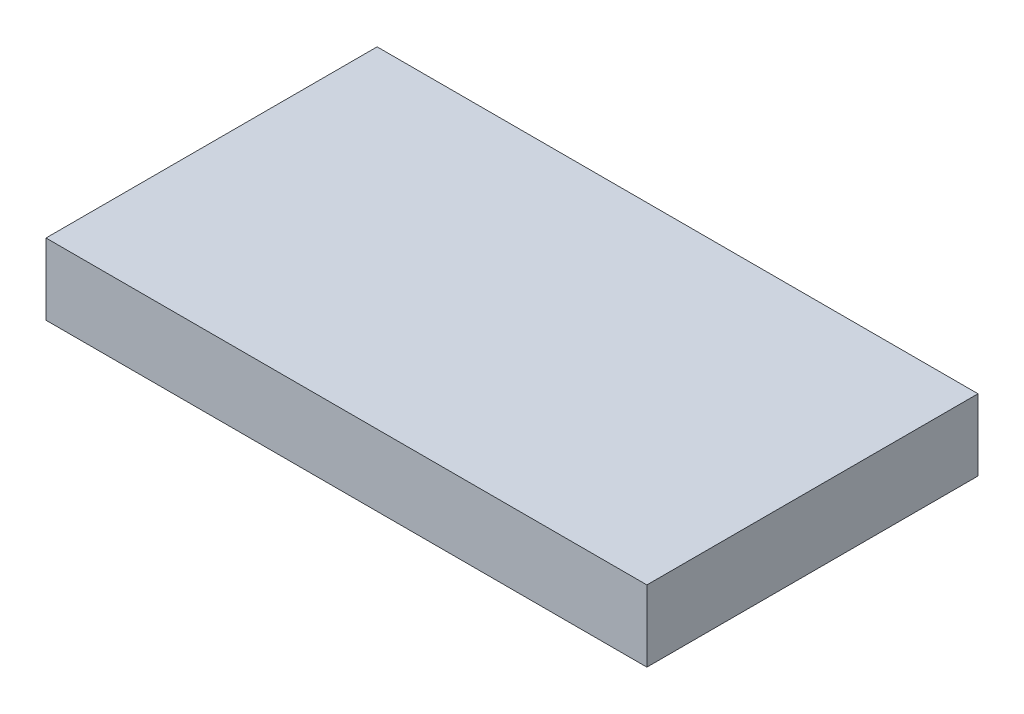
ISO-10303-21;
HEADER;
FILE_DESCRIPTION(('STEP AP214'),'2;1');
FILE_NAME('part.step','',(''),(''),'','','');
FILE_SCHEMA(('AUTOMOTIVE_DESIGN { 1 0 10303 214 1 1 1 1 }'));
ENDSEC;
DATA;
#1=APPLICATION_CONTEXT('core data for automotive mechanical design processes');
#2=APPLICATION_PROTOCOL_DEFINITION('international standard','automotive_design',2000,#1);
#3=PRODUCT_CONTEXT('',#1,'mechanical');
#4=PRODUCT('Part','Part','',(#3));
#5=PRODUCT_RELATED_PRODUCT_CATEGORY('part','',(#4));
#6=PRODUCT_DEFINITION_FORMATION('','',#4);
#7=PRODUCT_DEFINITION_CONTEXT('part definition',#1,'design');
#8=PRODUCT_DEFINITION('design','',#6,#7);
#9=PRODUCT_DEFINITION_SHAPE('','',#8);
#10=(LENGTH_UNIT() NAMED_UNIT(*) SI_UNIT(.MILLI.,.METRE.));
#11=(NAMED_UNIT(*) PLANE_ANGLE_UNIT() SI_UNIT($,.RADIAN.));
#12=(NAMED_UNIT(*) SI_UNIT($,.STERADIAN.) SOLID_ANGLE_UNIT());
#13=UNCERTAINTY_MEASURE_WITH_UNIT(LENGTH_MEASURE(1.E-05),#10,'distance_accuracy_value','');
#14=(GEOMETRIC_REPRESENTATION_CONTEXT(3) GLOBAL_UNCERTAINTY_ASSIGNED_CONTEXT((#13)) GLOBAL_UNIT_ASSIGNED_CONTEXT((#10,
#11,#12)) REPRESENTATION_CONTEXT('',''));
#15=CARTESIAN_POINT('',(0.,0.,0.));
#16=DIRECTION('',(0.,0.,1.));
#17=DIRECTION('',(1.,0.,0.));
#18=AXIS2_PLACEMENT_3D('',#15,#16,#17);
#19=CARTESIAN_POINT('',(30.,0.,0.));
#20=DIRECTION('',(0.,-1.,0.));
#21=DIRECTION('',(-1.,0.,0.));
#22=AXIS2_PLACEMENT_3D('',#19,#20,#21);
#23=SPHERICAL_SURFACE('',#22,2.5);
#24=CARTESIAN_POINT('',(30.,0.,0.));
#25=DIRECTION('',(0.,1.,0.));
#26=DIRECTION('',(0.,0.,1.));
#27=AXIS2_PLACEMENT_3D('',#24,#25,#26);
#28=CIRCLE('',#27,2.5);
#29=CARTESIAN_POINT('',(30.,0.,2.5));
#30=VERTEX_POINT('',#29);
#31=EDGE_CURVE('E11',#30,#30,#28,.F.);
#32=ORIENTED_EDGE('',*,*,#31,.T.);
#33=EDGE_LOOP('',(#32));
#34=FACE_BOUND('',#33,.T.);
#35=ADVANCED_FACE('F39',(#34),#23,.F.);
#36=CARTESIAN_POINT('',(20.,0.,0.));
#37=DIRECTION('',(0.,-1.,0.));
#38=DIRECTION('',(-1.,0.,0.));
#39=AXIS2_PLACEMENT_3D('',#36,#37,#38);
#40=SPHERICAL_SURFACE('',#39,2.5);
#41=CARTESIAN_POINT('',(20.,0.,0.));
#42=DIRECTION('',(0.,1.,0.));
#43=DIRECTION('',(0.,0.,1.));
#44=AXIS2_PLACEMENT_3D('',#41,#42,#43);
#45=CIRCLE('',#44,2.5);
#46=CARTESIAN_POINT('',(20.,0.,2.5));
#47=VERTEX_POINT('',#46);
#48=EDGE_CURVE('E49',#47,#47,#45,.F.);
#49=ORIENTED_EDGE('',*,*,#48,.T.);
#50=EDGE_LOOP('',(#49));
#51=FACE_BOUND('',#50,.T.);
#52=ADVANCED_FACE('F221',(#51),#40,.F.);
#53=CARTESIAN_POINT('',(10.,0.,0.));
#54=DIRECTION('',(0.,-1.,0.));
#55=DIRECTION('',(-1.,0.,0.));
#56=AXIS2_PLACEMENT_3D('',#53,#54,#55);
#57=SPHERICAL_SURFACE('',#56,2.5);
#58=CARTESIAN_POINT('',(10.,0.,0.));
#59=DIRECTION('',(0.,1.,0.));
#60=DIRECTION('',(0.,0.,1.));
#61=AXIS2_PLACEMENT_3D('',#58,#59,#60);
#62=CIRCLE('',#61,2.5);
#63=CARTESIAN_POINT('',(10.,0.,2.5));
#64=VERTEX_POINT('',#63);
#65=EDGE_CURVE('E130',#64,#64,#62,.F.);
#66=ORIENTED_EDGE('',*,*,#65,.T.);
#67=EDGE_LOOP('',(#66));
#68=FACE_BOUND('',#67,.T.);
#69=ADVANCED_FACE('F226',(#68),#57,.F.);
#70=CARTESIAN_POINT('',(42.1714106488219,10.,-23.2373319302225));
#71=DIRECTION('',(-1.,0.,0.));
#72=DIRECTION('',(0.,0.,1.));
#73=AXIS2_PLACEMENT_3D('',#70,#71,#72);
#74=PLANE('',#73);
#75=DIRECTION('',(0.,0.,-1.));
#76=VECTOR('',#75,1.);
#77=CARTESIAN_POINT('',(42.1714106488219,0.,-23.2373319302225));
#78=LINE('',#77,#76);
#79=CARTESIAN_POINT('',(42.1714106488219,0.,23.2373319302225));
#80=VERTEX_POINT('',#79);
#81=CARTESIAN_POINT('',(42.1714106488219,0.,-23.2373319302225));
#82=VERTEX_POINT('',#81);
#83=EDGE_CURVE('E113',#80,#82,#78,.T.);
#84=ORIENTED_EDGE('',*,*,#83,.T.);
#85=DIRECTION('',(0.,-1.,0.));
#86=VECTOR('',#85,1.);
#87=CARTESIAN_POINT('',(42.1714106488219,10.,-23.2373319302225));
#88=LINE('',#87,#86);
#89=CARTESIAN_POINT('',(42.1714106488219,10.,-23.2373319302225));
#90=VERTEX_POINT('',#89);
#91=EDGE_CURVE('E102',#90,#82,#88,.T.);
#92=ORIENTED_EDGE('',*,*,#91,.F.);
#93=DIRECTION('',(0.,0.,-1.));
#94=VECTOR('',#93,1.);
#95=CARTESIAN_POINT('',(42.1714106488219,10.,-23.2373319302225));
#96=LINE('',#95,#94);
#97=CARTESIAN_POINT('',(42.1714106488219,10.,23.2373319302225));
#98=VERTEX_POINT('',#97);
#99=EDGE_CURVE('E94',#98,#90,#96,.T.);
#100=ORIENTED_EDGE('',*,*,#99,.F.);
#101=DIRECTION('',(0.,-1.,0.));
#102=VECTOR('',#101,1.);
#103=CARTESIAN_POINT('',(42.1714106488219,10.,23.2373319302225));
#104=LINE('',#103,#102);
#105=EDGE_CURVE('E109',#98,#80,#104,.T.);
#106=ORIENTED_EDGE('',*,*,#105,.T.);
#107=EDGE_LOOP('',(#84,#92,#100,#106));
#108=FACE_BOUND('',#107,.T.);
#109=ADVANCED_FACE('F248',(#108),#74,.F.);
#110=CARTESIAN_POINT('',(-42.1714106488219,10.,-23.2373319302225));
#111=DIRECTION('',(0.,0.,1.));
#112=DIRECTION('',(1.,0.,0.));
#113=AXIS2_PLACEMENT_3D('',#110,#111,#112);
#114=PLANE('',#113);
#115=DIRECTION('',(-1.,0.,0.));
#116=VECTOR('',#115,1.);
#117=CARTESIAN_POINT('',(-42.1714106488219,0.,-23.2373319302225));
#118=LINE('',#117,#116);
#119=CARTESIAN_POINT('',(-42.1714106488219,0.,-23.2373319302225));
#120=VERTEX_POINT('',#119);
#121=EDGE_CURVE('E100',#82,#120,#118,.T.);
#122=ORIENTED_EDGE('',*,*,#121,.T.);
#123=DIRECTION('',(0.,-1.,0.));
#124=VECTOR('',#123,1.);
#125=CARTESIAN_POINT('',(-42.1714106488219,10.,-23.2373319302225));
#126=LINE('',#125,#124);
#127=CARTESIAN_POINT('',(-42.1714106488219,10.,-23.2373319302225));
#128=VERTEX_POINT('',#127);
#129=EDGE_CURVE('E98',#128,#120,#126,.T.);
#130=ORIENTED_EDGE('',*,*,#129,.F.);
#131=DIRECTION('',(-1.,0.,0.));
#132=VECTOR('',#131,1.);
#133=CARTESIAN_POINT('',(-42.1714106488219,10.,-23.2373319302225));
#134=LINE('',#133,#132);
#135=EDGE_CURVE('E89',#90,#128,#134,.T.);
#136=ORIENTED_EDGE('',*,*,#135,.F.);
#137=ORIENTED_EDGE('',*,*,#91,.T.);
#138=EDGE_LOOP('',(#122,#130,#136,#137));
#139=FACE_BOUND('',#138,.T.);
#140=ADVANCED_FACE('F99',(#139),#114,.F.);
#141=CARTESIAN_POINT('',(-42.1714106488219,10.,-23.2373319302225));
#142=DIRECTION('',(1.,0.,0.));
#143=DIRECTION('',(0.,0.,-1.));
#144=AXIS2_PLACEMENT_3D('',#141,#142,#143);
#145=PLANE('',#144);
#146=DIRECTION('',(0.,0.,1.));
#147=VECTOR('',#146,1.);
#148=CARTESIAN_POINT('',(-42.1714106488219,0.,-23.2373319302225));
#149=LINE('',#148,#147);
#150=CARTESIAN_POINT('',(-42.1714106488219,0.,23.2373319302225));
#151=VERTEX_POINT('',#150);
#152=EDGE_CURVE('E75',#120,#151,#149,.T.);
#153=ORIENTED_EDGE('',*,*,#152,.T.);
#154=DIRECTION('',(0.,-1.,0.));
#155=VECTOR('',#154,1.);
#156=CARTESIAN_POINT('',(-42.1714106488219,10.,23.2373319302225));
#157=LINE('',#156,#155);
#158=CARTESIAN_POINT('',(-42.1714106488219,10.,23.2373319302225));
#159=VERTEX_POINT('',#158);
#160=EDGE_CURVE('E103',#159,#151,#157,.T.);
#161=ORIENTED_EDGE('',*,*,#160,.F.);
#162=DIRECTION('',(0.,0.,1.));
#163=VECTOR('',#162,1.);
#164=CARTESIAN_POINT('',(-42.1714106488219,10.,-23.2373319302225));
#165=LINE('',#164,#163);
#166=EDGE_CURVE('E92',#128,#159,#165,.T.);
#167=ORIENTED_EDGE('',*,*,#166,.F.);
#168=ORIENTED_EDGE('',*,*,#129,.T.);
#169=EDGE_LOOP('',(#153,#161,#167,#168));
#170=FACE_BOUND('',#169,.T.);
#171=ADVANCED_FACE('F105',(#170),#145,.F.);
#172=CARTESIAN_POINT('',(-42.1714106488219,10.,23.2373319302225));
#173=DIRECTION('',(0.,0.,-1.));
#174=DIRECTION('',(-1.,0.,0.));
#175=AXIS2_PLACEMENT_3D('',#172,#173,#174);
#176=PLANE('',#175);
#177=DIRECTION('',(1.,0.,0.));
#178=VECTOR('',#177,1.);
#179=CARTESIAN_POINT('',(-42.1714106488219,0.,23.2373319302225));
#180=LINE('',#179,#178);
#181=EDGE_CURVE('E81',#151,#80,#180,.T.);
#182=ORIENTED_EDGE('',*,*,#181,.T.);
#183=ORIENTED_EDGE('',*,*,#105,.F.);
#184=DIRECTION('',(1.,0.,0.));
#185=VECTOR('',#184,1.);
#186=CARTESIAN_POINT('',(-42.1714106488219,10.,23.2373319302225));
#187=LINE('',#186,#185);
#188=EDGE_CURVE('E58',#159,#98,#187,.T.);
#189=ORIENTED_EDGE('',*,*,#188,.F.);
#190=ORIENTED_EDGE('',*,*,#160,.T.);
#191=EDGE_LOOP('',(#182,#183,#189,#190));
#192=FACE_BOUND('',#191,.T.);
#193=ADVANCED_FACE('F249',(#192),#176,.F.);
#194=CARTESIAN_POINT('',(0.,10.,0.));
#195=DIRECTION('',(0.,1.,0.));
#196=DIRECTION('',(0.,0.,1.));
#197=AXIS2_PLACEMENT_3D('',#194,#195,#196);
#198=PLANE('',#197);
#199=ORIENTED_EDGE('',*,*,#99,.T.);
#200=ORIENTED_EDGE('',*,*,#135,.T.);
#201=ORIENTED_EDGE('',*,*,#166,.T.);
#202=ORIENTED_EDGE('',*,*,#188,.T.);
#203=EDGE_LOOP('',(#199,#200,#201,#202));
#204=FACE_BOUND('',#203,.T.);
#205=ADVANCED_FACE('F90',(#204),#198,.T.);
#206=CARTESIAN_POINT('',(0.,0.,0.));
#207=DIRECTION('',(0.,1.,0.));
#208=DIRECTION('',(0.,0.,1.));
#209=AXIS2_PLACEMENT_3D('',#206,#207,#208);
#210=PLANE('',#209);
#211=CARTESIAN_POINT('',(-30.,0.,-15.));
#212=DIRECTION('',(0.,1.,0.));
#213=DIRECTION('',(0.,0.,1.));
#214=AXIS2_PLACEMENT_3D('',#211,#212,#213);
#215=CIRCLE('',#214,2.5);
#216=CARTESIAN_POINT('',(-30.,0.,-12.5));
#217=VERTEX_POINT('',#216);
#218=EDGE_CURVE('E42',#217,#217,#215,.T.);
#219=ORIENTED_EDGE('',*,*,#218,.T.);
#220=EDGE_LOOP('',(#219));
#221=FACE_BOUND('',#220,.T.);
#222=CARTESIAN_POINT('',(-20.,0.,-15.));
#223=DIRECTION('',(0.,1.,0.));
#224=DIRECTION('',(0.,0.,1.));
#225=AXIS2_PLACEMENT_3D('',#222,#223,#224);
#226=CIRCLE('',#225,2.5);
#227=CARTESIAN_POINT('',(-20.,0.,-12.5));
#228=VERTEX_POINT('',#227);
#229=EDGE_CURVE('E199',#228,#228,#226,.T.);
#230=ORIENTED_EDGE('',*,*,#229,.T.);
#231=EDGE_LOOP('',(#230));
#232=FACE_BOUND('',#231,.T.);
#233=CARTESIAN_POINT('',(-10.,0.,-15.));
#234=DIRECTION('',(0.,1.,0.));
#235=DIRECTION('',(0.,0.,1.));
#236=AXIS2_PLACEMENT_3D('',#233,#234,#235);
#237=CIRCLE('',#236,2.5);
#238=CARTESIAN_POINT('',(-10.,0.,-12.5));
#239=VERTEX_POINT('',#238);
#240=EDGE_CURVE('E196',#239,#239,#237,.T.);
#241=ORIENTED_EDGE('',*,*,#240,.T.);
#242=EDGE_LOOP('',(#241));
#243=FACE_BOUND('',#242,.T.);
#244=CARTESIAN_POINT('',(30.,0.,-15.));
#245=DIRECTION('',(0.,1.,0.));
#246=DIRECTION('',(0.,0.,1.));
#247=AXIS2_PLACEMENT_3D('',#244,#245,#246);
#248=CIRCLE('',#247,2.5);
#249=CARTESIAN_POINT('',(30.,0.,-12.5));
#250=VERTEX_POINT('',#249);
#251=EDGE_CURVE('E192',#250,#250,#248,.T.);
#252=ORIENTED_EDGE('',*,*,#251,.T.);
#253=EDGE_LOOP('',(#252));
#254=FACE_BOUND('',#253,.T.);
#255=CARTESIAN_POINT('',(20.,0.,-15.));
#256=DIRECTION('',(0.,1.,0.));
#257=DIRECTION('',(0.,0.,1.));
#258=AXIS2_PLACEMENT_3D('',#255,#256,#257);
#259=CIRCLE('',#258,2.5);
#260=CARTESIAN_POINT('',(20.,0.,-12.5));
#261=VERTEX_POINT('',#260);
#262=EDGE_CURVE('E188',#261,#261,#259,.T.);
#263=ORIENTED_EDGE('',*,*,#262,.T.);
#264=EDGE_LOOP('',(#263));
#265=FACE_BOUND('',#264,.T.);
#266=CARTESIAN_POINT('',(10.,0.,-15.));
#267=DIRECTION('',(0.,1.,0.));
#268=DIRECTION('',(0.,0.,1.));
#269=AXIS2_PLACEMENT_3D('',#266,#267,#268);
#270=CIRCLE('',#269,2.5);
#271=CARTESIAN_POINT('',(10.,0.,-12.5));
#272=VERTEX_POINT('',#271);
#273=EDGE_CURVE('E184',#272,#272,#270,.T.);
#274=ORIENTED_EDGE('',*,*,#273,.T.);
#275=EDGE_LOOP('',(#274));
#276=FACE_BOUND('',#275,.T.);
#277=CARTESIAN_POINT('',(0.,0.,-15.));
#278=DIRECTION('',(0.,1.,0.));
#279=DIRECTION('',(0.,0.,1.));
#280=AXIS2_PLACEMENT_3D('',#277,#278,#279);
#281=CIRCLE('',#280,2.5);
#282=CARTESIAN_POINT('',(0.,0.,-12.5));
#283=VERTEX_POINT('',#282);
#284=EDGE_CURVE('E180',#283,#283,#281,.T.);
#285=ORIENTED_EDGE('',*,*,#284,.T.);
#286=EDGE_LOOP('',(#285));
#287=FACE_BOUND('',#286,.T.);
#288=CARTESIAN_POINT('',(-30.,0.,15.));
#289=DIRECTION('',(0.,1.,0.));
#290=DIRECTION('',(0.,0.,1.));
#291=AXIS2_PLACEMENT_3D('',#288,#289,#290);
#292=CIRCLE('',#291,2.5);
#293=CARTESIAN_POINT('',(-30.,0.,17.5));
#294=VERTEX_POINT('',#293);
#295=EDGE_CURVE('E176',#294,#294,#292,.T.);
#296=ORIENTED_EDGE('',*,*,#295,.T.);
#297=EDGE_LOOP('',(#296));
#298=FACE_BOUND('',#297,.T.);
#299=CARTESIAN_POINT('',(-20.,0.,15.));
#300=DIRECTION('',(0.,1.,0.));
#301=DIRECTION('',(0.,0.,1.));
#302=AXIS2_PLACEMENT_3D('',#299,#300,#301);
#303=CIRCLE('',#302,2.5);
#304=CARTESIAN_POINT('',(-20.,0.,17.5));
#305=VERTEX_POINT('',#304);
#306=EDGE_CURVE('E172',#305,#305,#303,.T.);
#307=ORIENTED_EDGE('',*,*,#306,.T.);
#308=EDGE_LOOP('',(#307));
#309=FACE_BOUND('',#308,.T.);
#310=CARTESIAN_POINT('',(-10.,0.,15.));
#311=DIRECTION('',(0.,1.,0.));
#312=DIRECTION('',(0.,0.,1.));
#313=AXIS2_PLACEMENT_3D('',#310,#311,#312);
#314=CIRCLE('',#313,2.5);
#315=CARTESIAN_POINT('',(-10.,0.,17.5));
#316=VERTEX_POINT('',#315);
#317=EDGE_CURVE('E168',#316,#316,#314,.T.);
#318=ORIENTED_EDGE('',*,*,#317,.T.);
#319=EDGE_LOOP('',(#318));
#320=FACE_BOUND('',#319,.T.);
#321=CARTESIAN_POINT('',(30.,0.,15.));
#322=DIRECTION('',(0.,1.,0.));
#323=DIRECTION('',(0.,0.,1.));
#324=AXIS2_PLACEMENT_3D('',#321,#322,#323);
#325=CIRCLE('',#324,2.5);
#326=CARTESIAN_POINT('',(30.,0.,17.5));
#327=VERTEX_POINT('',#326);
#328=EDGE_CURVE('E164',#327,#327,#325,.T.);
#329=ORIENTED_EDGE('',*,*,#328,.T.);
#330=EDGE_LOOP('',(#329));
#331=FACE_BOUND('',#330,.T.);
#332=CARTESIAN_POINT('',(20.,0.,15.));
#333=DIRECTION('',(0.,1.,0.));
#334=DIRECTION('',(0.,0.,1.));
#335=AXIS2_PLACEMENT_3D('',#332,#333,#334);
#336=CIRCLE('',#335,2.5);
#337=CARTESIAN_POINT('',(20.,0.,17.5));
#338=VERTEX_POINT('',#337);
#339=EDGE_CURVE('E160',#338,#338,#336,.T.);
#340=ORIENTED_EDGE('',*,*,#339,.T.);
#341=EDGE_LOOP('',(#340));
#342=FACE_BOUND('',#341,.T.);
#343=CARTESIAN_POINT('',(10.,0.,15.));
#344=DIRECTION('',(0.,1.,0.));
#345=DIRECTION('',(0.,0.,1.));
#346=AXIS2_PLACEMENT_3D('',#343,#344,#345);
#347=CIRCLE('',#346,2.5);
#348=CARTESIAN_POINT('',(10.,0.,17.5));
#349=VERTEX_POINT('',#348);
#350=EDGE_CURVE('E156',#349,#349,#347,.T.);
#351=ORIENTED_EDGE('',*,*,#350,.T.);
#352=EDGE_LOOP('',(#351));
#353=FACE_BOUND('',#352,.T.);
#354=CARTESIAN_POINT('',(0.,0.,15.));
#355=DIRECTION('',(0.,1.,0.));
#356=DIRECTION('',(0.,0.,1.));
#357=AXIS2_PLACEMENT_3D('',#354,#355,#356);
#358=CIRCLE('',#357,2.5);
#359=CARTESIAN_POINT('',(0.,0.,17.5));
#360=VERTEX_POINT('',#359);
#361=EDGE_CURVE('E146',#360,#360,#358,.T.);
#362=ORIENTED_EDGE('',*,*,#361,.T.);
#363=EDGE_LOOP('',(#362));
#364=FACE_BOUND('',#363,.T.);
#365=ORIENTED_EDGE('',*,*,#31,.F.);
#366=EDGE_LOOP('',(#365));
#367=FACE_BOUND('',#366,.T.);
#368=ORIENTED_EDGE('',*,*,#48,.F.);
#369=EDGE_LOOP('',(#368));
#370=FACE_BOUND('',#369,.T.);
#371=ORIENTED_EDGE('',*,*,#65,.F.);
#372=EDGE_LOOP('',(#371));
#373=FACE_BOUND('',#372,.T.);
#374=CARTESIAN_POINT('',(-30.,0.,0.));
#375=DIRECTION('',(0.,1.,0.));
#376=DIRECTION('',(0.,0.,1.));
#377=AXIS2_PLACEMENT_3D('',#374,#375,#376);
#378=CIRCLE('',#377,2.5);
#379=CARTESIAN_POINT('',(-30.,0.,2.5));
#380=VERTEX_POINT('',#379);
#381=EDGE_CURVE('E142',#380,#380,#378,.F.);
#382=ORIENTED_EDGE('',*,*,#381,.F.);
#383=EDGE_LOOP('',(#382));
#384=FACE_BOUND('',#383,.T.);
#385=CARTESIAN_POINT('',(-20.,0.,0.));
#386=DIRECTION('',(0.,1.,0.));
#387=DIRECTION('',(0.,0.,1.));
#388=AXIS2_PLACEMENT_3D('',#385,#386,#387);
#389=CIRCLE('',#388,2.5);
#390=CARTESIAN_POINT('',(-20.,0.,2.5));
#391=VERTEX_POINT('',#390);
#392=EDGE_CURVE('E138',#391,#391,#389,.F.);
#393=ORIENTED_EDGE('',*,*,#392,.F.);
#394=EDGE_LOOP('',(#393));
#395=FACE_BOUND('',#394,.T.);
#396=CARTESIAN_POINT('',(-10.,0.,0.));
#397=DIRECTION('',(0.,1.,0.));
#398=DIRECTION('',(0.,0.,1.));
#399=AXIS2_PLACEMENT_3D('',#396,#397,#398);
#400=CIRCLE('',#399,2.5);
#401=CARTESIAN_POINT('',(-10.,0.,2.5));
#402=VERTEX_POINT('',#401);
#403=EDGE_CURVE('E134',#402,#402,#400,.F.);
#404=ORIENTED_EDGE('',*,*,#403,.F.);
#405=EDGE_LOOP('',(#404));
#406=FACE_BOUND('',#405,.T.);
#407=CARTESIAN_POINT('',(0.,0.,0.));
#408=DIRECTION('',(0.,1.,0.));
#409=DIRECTION('',(0.,0.,1.));
#410=AXIS2_PLACEMENT_3D('',#407,#408,#409);
#411=CIRCLE('',#410,2.5);
#412=CARTESIAN_POINT('',(0.,0.,2.5));
#413=VERTEX_POINT('',#412);
#414=EDGE_CURVE('E117',#413,#413,#411,.F.);
#415=ORIENTED_EDGE('',*,*,#414,.F.);
#416=EDGE_LOOP('',(#415));
#417=FACE_BOUND('',#416,.T.);
#418=ORIENTED_EDGE('',*,*,#83,.F.);
#419=ORIENTED_EDGE('',*,*,#181,.F.);
#420=ORIENTED_EDGE('',*,*,#152,.F.);
#421=ORIENTED_EDGE('',*,*,#121,.F.);
#422=EDGE_LOOP('',(#418,#419,#420,#421));
#423=FACE_BOUND('',#422,.T.);
#424=ADVANCED_FACE('F208',(#221,#232,#243,#254,#265,#276,#287,#298,#309,#320,#331,#342,#353,
#364,#367,#370,#373,#384,#395,#406,#417,#423),#210,.F.);
#425=CARTESIAN_POINT('',(0.,0.,0.));
#426=DIRECTION('',(0.,-1.,0.));
#427=DIRECTION('',(-1.,0.,0.));
#428=AXIS2_PLACEMENT_3D('',#425,#426,#427);
#429=SPHERICAL_SURFACE('',#428,2.5);
#430=ORIENTED_EDGE('',*,*,#414,.T.);
#431=EDGE_LOOP('',(#430));
#432=FACE_BOUND('',#431,.T.);
#433=ADVANCED_FACE('F232',(#432),#429,.F.);
#434=CARTESIAN_POINT('',(-10.,0.,0.));
#435=DIRECTION('',(0.,-1.,0.));
#436=DIRECTION('',(-1.,0.,0.));
#437=AXIS2_PLACEMENT_3D('',#434,#435,#436);
#438=SPHERICAL_SURFACE('',#437,2.5);
#439=ORIENTED_EDGE('',*,*,#403,.T.);
#440=EDGE_LOOP('',(#439));
#441=FACE_BOUND('',#440,.T.);
#442=ADVANCED_FACE('F302',(#441),#438,.F.);
#443=CARTESIAN_POINT('',(-20.,0.,0.));
#444=DIRECTION('',(0.,-1.,0.));
#445=DIRECTION('',(-1.,0.,0.));
#446=AXIS2_PLACEMENT_3D('',#443,#444,#445);
#447=SPHERICAL_SURFACE('',#446,2.5);
#448=ORIENTED_EDGE('',*,*,#392,.T.);
#449=EDGE_LOOP('',(#448));
#450=FACE_BOUND('',#449,.T.);
#451=ADVANCED_FACE('F312',(#450),#447,.F.);
#452=CARTESIAN_POINT('',(-30.,0.,0.));
#453=DIRECTION('',(0.,-1.,0.));
#454=DIRECTION('',(-1.,0.,0.));
#455=AXIS2_PLACEMENT_3D('',#452,#453,#454);
#456=SPHERICAL_SURFACE('',#455,2.5);
#457=ORIENTED_EDGE('',*,*,#381,.T.);
#458=EDGE_LOOP('',(#457));
#459=FACE_BOUND('',#458,.T.);
#460=ADVANCED_FACE('F322',(#459),#456,.F.);
#461=CARTESIAN_POINT('',(0.,0.,15.));
#462=DIRECTION('',(0.,1.,0.));
#463=DIRECTION('',(1.,0.,0.));
#464=AXIS2_PLACEMENT_3D('',#461,#462,#463);
#465=SPHERICAL_SURFACE('',#464,2.5);
#466=ORIENTED_EDGE('',*,*,#361,.F.);
#467=EDGE_LOOP('',(#466));
#468=FACE_BOUND('',#467,.T.);
#469=ADVANCED_FACE('F331',(#468),#465,.F.);
#470=CARTESIAN_POINT('',(10.,0.,15.));
#471=DIRECTION('',(0.,1.,0.));
#472=DIRECTION('',(1.,0.,0.));
#473=AXIS2_PLACEMENT_3D('',#470,#471,#472);
#474=SPHERICAL_SURFACE('',#473,2.5);
#475=ORIENTED_EDGE('',*,*,#350,.F.);
#476=EDGE_LOOP('',(#475));
#477=FACE_BOUND('',#476,.T.);
#478=ADVANCED_FACE('F352',(#477),#474,.F.);
#479=CARTESIAN_POINT('',(20.,0.,15.));
#480=DIRECTION('',(0.,1.,0.));
#481=DIRECTION('',(1.,0.,0.));
#482=AXIS2_PLACEMENT_3D('',#479,#480,#481);
#483=SPHERICAL_SURFACE('',#482,2.5);
#484=ORIENTED_EDGE('',*,*,#339,.F.);
#485=EDGE_LOOP('',(#484));
#486=FACE_BOUND('',#485,.T.);
#487=ADVANCED_FACE('F361',(#486),#483,.F.);
#488=CARTESIAN_POINT('',(30.,0.,15.));
#489=DIRECTION('',(0.,1.,0.));
#490=DIRECTION('',(1.,0.,0.));
#491=AXIS2_PLACEMENT_3D('',#488,#489,#490);
#492=SPHERICAL_SURFACE('',#491,2.5);
#493=ORIENTED_EDGE('',*,*,#328,.F.);
#494=EDGE_LOOP('',(#493));
#495=FACE_BOUND('',#494,.T.);
#496=ADVANCED_FACE('F370',(#495),#492,.F.);
#497=CARTESIAN_POINT('',(-10.,0.,15.));
#498=DIRECTION('',(0.,1.,0.));
#499=DIRECTION('',(1.,0.,0.));
#500=AXIS2_PLACEMENT_3D('',#497,#498,#499);
#501=SPHERICAL_SURFACE('',#500,2.5);
#502=ORIENTED_EDGE('',*,*,#317,.F.);
#503=EDGE_LOOP('',(#502));
#504=FACE_BOUND('',#503,.T.);
#505=ADVANCED_FACE('F379',(#504),#501,.F.);
#506=CARTESIAN_POINT('',(-20.,0.,15.));
#507=DIRECTION('',(0.,1.,0.));
#508=DIRECTION('',(1.,0.,0.));
#509=AXIS2_PLACEMENT_3D('',#506,#507,#508);
#510=SPHERICAL_SURFACE('',#509,2.5);
#511=ORIENTED_EDGE('',*,*,#306,.F.);
#512=EDGE_LOOP('',(#511));
#513=FACE_BOUND('',#512,.T.);
#514=ADVANCED_FACE('F388',(#513),#510,.F.);
#515=CARTESIAN_POINT('',(-30.,0.,15.));
#516=DIRECTION('',(0.,1.,0.));
#517=DIRECTION('',(1.,0.,0.));
#518=AXIS2_PLACEMENT_3D('',#515,#516,#517);
#519=SPHERICAL_SURFACE('',#518,2.5);
#520=ORIENTED_EDGE('',*,*,#295,.F.);
#521=EDGE_LOOP('',(#520));
#522=FACE_BOUND('',#521,.T.);
#523=ADVANCED_FACE('F397',(#522),#519,.F.);
#524=CARTESIAN_POINT('',(0.,0.,-15.));
#525=DIRECTION('',(0.,1.,0.));
#526=DIRECTION('',(1.,0.,0.));
#527=AXIS2_PLACEMENT_3D('',#524,#525,#526);
#528=SPHERICAL_SURFACE('',#527,2.5);
#529=ORIENTED_EDGE('',*,*,#284,.F.);
#530=EDGE_LOOP('',(#529));
#531=FACE_BOUND('',#530,.T.);
#532=ADVANCED_FACE('F406',(#531),#528,.F.);
#533=CARTESIAN_POINT('',(10.,0.,-15.));
#534=DIRECTION('',(0.,1.,0.));
#535=DIRECTION('',(1.,0.,0.));
#536=AXIS2_PLACEMENT_3D('',#533,#534,#535);
#537=SPHERICAL_SURFACE('',#536,2.5);
#538=ORIENTED_EDGE('',*,*,#273,.F.);
#539=EDGE_LOOP('',(#538));
#540=FACE_BOUND('',#539,.T.);
#541=ADVANCED_FACE('F416',(#540),#537,.F.);
#542=CARTESIAN_POINT('',(20.,0.,-15.));
#543=DIRECTION('',(0.,1.,0.));
#544=DIRECTION('',(1.,0.,0.));
#545=AXIS2_PLACEMENT_3D('',#542,#543,#544);
#546=SPHERICAL_SURFACE('',#545,2.5);
#547=ORIENTED_EDGE('',*,*,#262,.F.);
#548=EDGE_LOOP('',(#547));
#549=FACE_BOUND('',#548,.T.);
#550=ADVANCED_FACE('F425',(#549),#546,.F.);
#551=CARTESIAN_POINT('',(30.,0.,-15.));
#552=DIRECTION('',(0.,1.,0.));
#553=DIRECTION('',(1.,0.,0.));
#554=AXIS2_PLACEMENT_3D('',#551,#552,#553);
#555=SPHERICAL_SURFACE('',#554,2.5);
#556=ORIENTED_EDGE('',*,*,#251,.F.);
#557=EDGE_LOOP('',(#556));
#558=FACE_BOUND('',#557,.T.);
#559=ADVANCED_FACE('F434',(#558),#555,.F.);
#560=CARTESIAN_POINT('',(-10.,0.,-15.));
#561=DIRECTION('',(0.,1.,0.));
#562=DIRECTION('',(1.,0.,0.));
#563=AXIS2_PLACEMENT_3D('',#560,#561,#562);
#564=SPHERICAL_SURFACE('',#563,2.5);
#565=ORIENTED_EDGE('',*,*,#240,.F.);
#566=EDGE_LOOP('',(#565));
#567=FACE_BOUND('',#566,.T.);
#568=ADVANCED_FACE('F217',(#567),#564,.F.);
#569=CARTESIAN_POINT('',(-20.,0.,-15.));
#570=DIRECTION('',(0.,1.,0.));
#571=DIRECTION('',(1.,0.,0.));
#572=AXIS2_PLACEMENT_3D('',#569,#570,#571);
#573=SPHERICAL_SURFACE('',#572,2.5);
#574=ORIENTED_EDGE('',*,*,#229,.F.);
#575=EDGE_LOOP('',(#574));
#576=FACE_BOUND('',#575,.T.);
#577=ADVANCED_FACE('F212',(#576),#573,.F.);
#578=CARTESIAN_POINT('',(-30.,0.,-15.));
#579=DIRECTION('',(0.,1.,0.));
#580=DIRECTION('',(1.,0.,0.));
#581=AXIS2_PLACEMENT_3D('',#578,#579,#580);
#582=SPHERICAL_SURFACE('',#581,2.5);
#583=ORIENTED_EDGE('',*,*,#218,.F.);
#584=EDGE_LOOP('',(#583));
#585=FACE_BOUND('',#584,.T.);
#586=ADVANCED_FACE('F210',(#585),#582,.F.);
#587=CLOSED_SHELL('',(#35,#52,#69,#109,#140,#171,#193,#205,#424,#433,#442,#451,#460,#469,#478,
#487,#496,#505,#514,#523,#532,#541,#550,#559,#568,#577,#586));
#588=MANIFOLD_SOLID_BREP('B2',#587);
#589=ADVANCED_BREP_SHAPE_REPRESENTATION('',(#18,#588),#14);
#590=SHAPE_DEFINITION_REPRESENTATION(#9,#589);
ENDSEC;
END-ISO-10303-21;
